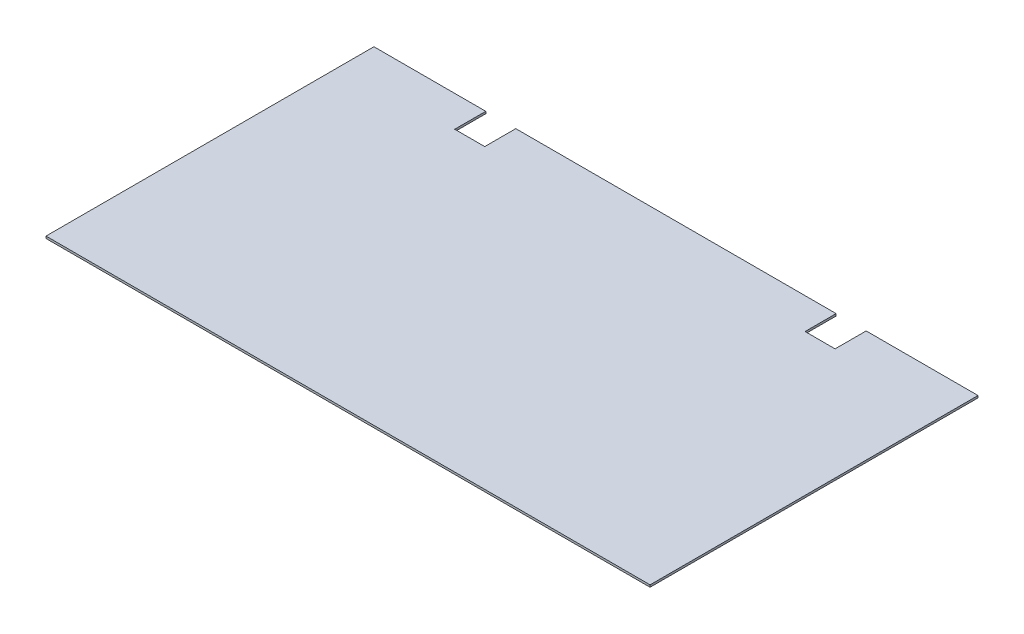
ISO-10303-21;
HEADER;
FILE_DESCRIPTION(('STEP AP214'),'2;1');
FILE_NAME('part.step','',(''),(''),'','','');
FILE_SCHEMA(('AUTOMOTIVE_DESIGN { 1 0 10303 214 1 1 1 1 }'));
ENDSEC;
DATA;
#1=APPLICATION_CONTEXT('core data for automotive mechanical design processes');
#2=APPLICATION_PROTOCOL_DEFINITION('international standard','automotive_design',2000,#1);
#3=PRODUCT_CONTEXT('',#1,'mechanical');
#4=PRODUCT('Part','Part','',(#3));
#5=PRODUCT_RELATED_PRODUCT_CATEGORY('part','',(#4));
#6=PRODUCT_DEFINITION_FORMATION('','',#4);
#7=PRODUCT_DEFINITION_CONTEXT('part definition',#1,'design');
#8=PRODUCT_DEFINITION('design','',#6,#7);
#9=PRODUCT_DEFINITION_SHAPE('','',#8);
#10=(LENGTH_UNIT() NAMED_UNIT(*) SI_UNIT(.MILLI.,.METRE.));
#11=(NAMED_UNIT(*) PLANE_ANGLE_UNIT() SI_UNIT($,.RADIAN.));
#12=(NAMED_UNIT(*) SI_UNIT($,.STERADIAN.) SOLID_ANGLE_UNIT());
#13=UNCERTAINTY_MEASURE_WITH_UNIT(LENGTH_MEASURE(1.E-05),#10,'distance_accuracy_value','');
#14=(GEOMETRIC_REPRESENTATION_CONTEXT(3) GLOBAL_UNCERTAINTY_ASSIGNED_CONTEXT((#13)) GLOBAL_UNIT_ASSIGNED_CONTEXT((#10,
#11,#12)) REPRESENTATION_CONTEXT('',''));
#15=CARTESIAN_POINT('',(0.,0.,0.));
#16=DIRECTION('',(0.,0.,1.));
#17=DIRECTION('',(1.,0.,0.));
#18=AXIS2_PLACEMENT_3D('',#15,#16,#17);
#19=CARTESIAN_POINT('',(222.25,1.5621,-120.65));
#20=DIRECTION('',(0.,0.,1.));
#21=DIRECTION('',(1.,0.,0.));
#22=AXIS2_PLACEMENT_3D('',#19,#20,#21);
#23=PLANE('',#22);
#24=DIRECTION('',(-1.,0.,0.));
#25=VECTOR('',#24,1.);
#26=CARTESIAN_POINT('',(222.25,1.5621,-120.65));
#27=LINE('',#26,#25);
#28=CARTESIAN_POINT('',(-139.954,1.5621,-120.65));
#29=VERTEX_POINT('',#28);
#30=CARTESIAN_POINT('',(-222.25,1.5621,-120.65));
#31=VERTEX_POINT('',#30);
#32=EDGE_CURVE('E191',#29,#31,#27,.T.);
#33=ORIENTED_EDGE('',*,*,#32,.F.);
#34=DIRECTION('',(0.,1.,0.));
#35=VECTOR('',#34,1.);
#36=CARTESIAN_POINT('',(-139.954,-0.000999999999999916,-120.65));
#37=LINE('',#36,#35);
#38=CARTESIAN_POINT('',(-139.954,0.,-120.65));
#39=VERTEX_POINT('',#38);
#40=EDGE_CURVE('E142',#39,#29,#37,.T.);
#41=ORIENTED_EDGE('',*,*,#40,.F.);
#42=DIRECTION('',(-1.,0.,0.));
#43=VECTOR('',#42,1.);
#44=CARTESIAN_POINT('',(222.25,0.,-120.65));
#45=LINE('',#44,#43);
#46=CARTESIAN_POINT('',(-222.25,0.,-120.65));
#47=VERTEX_POINT('',#46);
#48=EDGE_CURVE('E147',#39,#47,#45,.T.);
#49=ORIENTED_EDGE('',*,*,#48,.T.);
#50=DIRECTION('',(0.,-1.,0.));
#51=VECTOR('',#50,1.);
#52=CARTESIAN_POINT('',(-222.25,1.5621,-120.65));
#53=LINE('',#52,#51);
#54=EDGE_CURVE('E195',#31,#47,#53,.T.);
#55=ORIENTED_EDGE('',*,*,#54,.F.);
#56=EDGE_LOOP('',(#33,#41,#49,#55));
#57=FACE_BOUND('',#56,.T.);
#58=ADVANCED_FACE('F35',(#57),#23,.F.);
#59=CARTESIAN_POINT('',(222.25,0.,-120.65));
#60=VERTEX_POINT('',#59);
#61=CARTESIAN_POINT('',(139.954,0.,-120.65));
#62=VERTEX_POINT('',#61);
#63=EDGE_CURVE('E187',#60,#62,#45,.T.);
#64=ORIENTED_EDGE('',*,*,#63,.T.);
#65=DIRECTION('',(0.,1.,0.));
#66=VECTOR('',#65,1.);
#67=CARTESIAN_POINT('',(139.954,-0.000999999999999916,-120.65));
#68=LINE('',#67,#66);
#69=CARTESIAN_POINT('',(139.954,1.5621,-120.65));
#70=VERTEX_POINT('',#69);
#71=EDGE_CURVE('E175',#62,#70,#68,.T.);
#72=ORIENTED_EDGE('',*,*,#71,.T.);
#73=CARTESIAN_POINT('',(222.25,1.5621,-120.65));
#74=VERTEX_POINT('',#73);
#75=EDGE_CURVE('E192',#74,#70,#27,.T.);
#76=ORIENTED_EDGE('',*,*,#75,.F.);
#77=DIRECTION('',(0.,-1.,0.));
#78=VECTOR('',#77,1.);
#79=CARTESIAN_POINT('',(222.25,1.5621,-120.65));
#80=LINE('',#79,#78);
#81=EDGE_CURVE('E208',#74,#60,#80,.T.);
#82=ORIENTED_EDGE('',*,*,#81,.T.);
#83=EDGE_LOOP('',(#64,#72,#76,#82));
#84=FACE_BOUND('',#83,.T.);
#85=ADVANCED_FACE('F221',(#84),#23,.F.);
#86=CARTESIAN_POINT('',(-222.25,1.5621,120.65));
#87=DIRECTION('',(1.,0.,0.));
#88=DIRECTION('',(0.,0.,-1.));
#89=AXIS2_PLACEMENT_3D('',#86,#87,#88);
#90=PLANE('',#89);
#91=DIRECTION('',(0.,0.,1.));
#92=VECTOR('',#91,1.);
#93=CARTESIAN_POINT('',(-222.25,0.,120.65));
#94=LINE('',#93,#92);
#95=CARTESIAN_POINT('',(-222.25,0.,120.65));
#96=VERTEX_POINT('',#95);
#97=EDGE_CURVE('E141',#47,#96,#94,.T.);
#98=ORIENTED_EDGE('',*,*,#97,.T.);
#99=DIRECTION('',(0.,-1.,0.));
#100=VECTOR('',#99,1.);
#101=CARTESIAN_POINT('',(-222.25,1.5621,120.65));
#102=LINE('',#101,#100);
#103=CARTESIAN_POINT('',(-222.25,1.5621,120.65));
#104=VERTEX_POINT('',#103);
#105=EDGE_CURVE('E11',#104,#96,#102,.T.);
#106=ORIENTED_EDGE('',*,*,#105,.F.);
#107=DIRECTION('',(0.,0.,1.));
#108=VECTOR('',#107,1.);
#109=CARTESIAN_POINT('',(-222.25,1.5621,120.65));
#110=LINE('',#109,#108);
#111=EDGE_CURVE('E183',#31,#104,#110,.T.);
#112=ORIENTED_EDGE('',*,*,#111,.F.);
#113=ORIENTED_EDGE('',*,*,#54,.T.);
#114=EDGE_LOOP('',(#98,#106,#112,#113));
#115=FACE_BOUND('',#114,.T.);
#116=ADVANCED_FACE('F37',(#115),#90,.F.);
#117=CARTESIAN_POINT('',(222.25,1.5621,120.65));
#118=DIRECTION('',(0.,0.,-1.));
#119=DIRECTION('',(-1.,0.,0.));
#120=AXIS2_PLACEMENT_3D('',#117,#118,#119);
#121=PLANE('',#120);
#122=DIRECTION('',(1.,0.,0.));
#123=VECTOR('',#122,1.);
#124=CARTESIAN_POINT('',(222.25,0.,120.65));
#125=LINE('',#124,#123);
#126=CARTESIAN_POINT('',(222.25,0.,120.65));
#127=VERTEX_POINT('',#126);
#128=EDGE_CURVE('E199',#96,#127,#125,.T.);
#129=ORIENTED_EDGE('',*,*,#128,.T.);
#130=DIRECTION('',(0.,-1.,0.));
#131=VECTOR('',#130,1.);
#132=CARTESIAN_POINT('',(222.25,1.5621,120.65));
#133=LINE('',#132,#131);
#134=CARTESIAN_POINT('',(222.25,1.5621,120.65));
#135=VERTEX_POINT('',#134);
#136=EDGE_CURVE('E43',#135,#127,#133,.T.);
#137=ORIENTED_EDGE('',*,*,#136,.F.);
#138=DIRECTION('',(1.,0.,0.));
#139=VECTOR('',#138,1.);
#140=CARTESIAN_POINT('',(222.25,1.5621,120.65));
#141=LINE('',#140,#139);
#142=EDGE_CURVE('E186',#104,#135,#141,.T.);
#143=ORIENTED_EDGE('',*,*,#142,.F.);
#144=ORIENTED_EDGE('',*,*,#105,.T.);
#145=EDGE_LOOP('',(#129,#137,#143,#144));
#146=FACE_BOUND('',#145,.T.);
#147=ADVANCED_FACE('F229',(#146),#121,.F.);
#148=CARTESIAN_POINT('',(222.25,1.5621,120.65));
#149=DIRECTION('',(-1.,0.,0.));
#150=DIRECTION('',(0.,0.,1.));
#151=AXIS2_PLACEMENT_3D('',#148,#149,#150);
#152=PLANE('',#151);
#153=DIRECTION('',(0.,0.,-1.));
#154=VECTOR('',#153,1.);
#155=CARTESIAN_POINT('',(222.25,0.,120.65));
#156=LINE('',#155,#154);
#157=EDGE_CURVE('E201',#127,#60,#156,.T.);
#158=ORIENTED_EDGE('',*,*,#157,.T.);
#159=ORIENTED_EDGE('',*,*,#81,.F.);
#160=DIRECTION('',(0.,0.,-1.));
#161=VECTOR('',#160,1.);
#162=CARTESIAN_POINT('',(222.25,1.5621,120.65));
#163=LINE('',#162,#161);
#164=EDGE_CURVE('E189',#135,#74,#163,.T.);
#165=ORIENTED_EDGE('',*,*,#164,.F.);
#166=ORIENTED_EDGE('',*,*,#136,.T.);
#167=EDGE_LOOP('',(#158,#159,#165,#166));
#168=FACE_BOUND('',#167,.T.);
#169=ADVANCED_FACE('F215',(#168),#152,.F.);
#170=CARTESIAN_POINT('',(117.856,0.,-120.65));
#171=VERTEX_POINT('',#170);
#172=CARTESIAN_POINT('',(-117.856,0.,-120.65));
#173=VERTEX_POINT('',#172);
#174=EDGE_CURVE('E205',#171,#173,#45,.T.);
#175=ORIENTED_EDGE('',*,*,#174,.T.);
#176=DIRECTION('',(0.,1.,0.));
#177=VECTOR('',#176,1.);
#178=CARTESIAN_POINT('',(-117.856,-0.000999999999999916,-120.65));
#179=LINE('',#178,#177);
#180=CARTESIAN_POINT('',(-117.856,1.5621,-120.65));
#181=VERTEX_POINT('',#180);
#182=EDGE_CURVE('E157',#173,#181,#179,.T.);
#183=ORIENTED_EDGE('',*,*,#182,.T.);
#184=CARTESIAN_POINT('',(117.856,1.5621,-120.65));
#185=VERTEX_POINT('',#184);
#186=EDGE_CURVE('E196',#185,#181,#27,.T.);
#187=ORIENTED_EDGE('',*,*,#186,.F.);
#188=DIRECTION('',(0.,1.,0.));
#189=VECTOR('',#188,1.);
#190=CARTESIAN_POINT('',(117.856,-0.000999999999999916,-120.65));
#191=LINE('',#190,#189);
#192=EDGE_CURVE('E179',#171,#185,#191,.T.);
#193=ORIENTED_EDGE('',*,*,#192,.F.);
#194=EDGE_LOOP('',(#175,#183,#187,#193));
#195=FACE_BOUND('',#194,.T.);
#196=ADVANCED_FACE('F238',(#195),#23,.F.);
#197=CARTESIAN_POINT('',(0.,1.5621,0.));
#198=DIRECTION('',(0.,1.,0.));
#199=DIRECTION('',(0.,0.,1.));
#200=AXIS2_PLACEMENT_3D('',#197,#198,#199);
#201=PLANE('',#200);
#202=DIRECTION('',(0.,0.,1.));
#203=VECTOR('',#202,1.);
#204=CARTESIAN_POINT('',(-139.954,1.5621,-120.65));
#205=LINE('',#204,#203);
#206=CARTESIAN_POINT('',(-139.954,1.5621,-97.79));
#207=VERTEX_POINT('',#206);
#208=EDGE_CURVE('E130',#29,#207,#205,.T.);
#209=ORIENTED_EDGE('',*,*,#208,.F.);
#210=ORIENTED_EDGE('',*,*,#32,.T.);
#211=ORIENTED_EDGE('',*,*,#111,.T.);
#212=ORIENTED_EDGE('',*,*,#142,.T.);
#213=ORIENTED_EDGE('',*,*,#164,.T.);
#214=ORIENTED_EDGE('',*,*,#75,.T.);
#215=DIRECTION('',(0.,0.,-1.));
#216=VECTOR('',#215,1.);
#217=CARTESIAN_POINT('',(139.954,1.5621,-120.65));
#218=LINE('',#217,#216);
#219=CARTESIAN_POINT('',(139.954,1.5621,-97.79));
#220=VERTEX_POINT('',#219);
#221=EDGE_CURVE('E167',#220,#70,#218,.T.);
#222=ORIENTED_EDGE('',*,*,#221,.F.);
#223=DIRECTION('',(1.,0.,0.));
#224=VECTOR('',#223,1.);
#225=CARTESIAN_POINT('',(139.954,1.5621,-97.79));
#226=LINE('',#225,#224);
#227=CARTESIAN_POINT('',(117.856,1.5621,-97.79));
#228=VERTEX_POINT('',#227);
#229=EDGE_CURVE('E172',#228,#220,#226,.T.);
#230=ORIENTED_EDGE('',*,*,#229,.F.);
#231=DIRECTION('',(0.,0.,1.));
#232=VECTOR('',#231,1.);
#233=CARTESIAN_POINT('',(117.856,1.5621,-120.65));
#234=LINE('',#233,#232);
#235=EDGE_CURVE('E169',#185,#228,#234,.T.);
#236=ORIENTED_EDGE('',*,*,#235,.F.);
#237=ORIENTED_EDGE('',*,*,#186,.T.);
#238=DIRECTION('',(0.,0.,-1.));
#239=VECTOR('',#238,1.);
#240=CARTESIAN_POINT('',(-117.856,1.5621,-120.65));
#241=LINE('',#240,#239);
#242=CARTESIAN_POINT('',(-117.856,1.5621,-97.79));
#243=VERTEX_POINT('',#242);
#244=EDGE_CURVE('E135',#243,#181,#241,.T.);
#245=ORIENTED_EDGE('',*,*,#244,.F.);
#246=DIRECTION('',(1.,0.,0.));
#247=VECTOR('',#246,1.);
#248=CARTESIAN_POINT('',(-139.954,1.5621,-97.79));
#249=LINE('',#248,#247);
#250=EDGE_CURVE('E149',#207,#243,#249,.T.);
#251=ORIENTED_EDGE('',*,*,#250,.F.);
#252=EDGE_LOOP('',(#209,#210,#211,#212,#213,#214,#222,#230,#236,#237,#245,#251));
#253=FACE_BOUND('',#252,.T.);
#254=ADVANCED_FACE('F225',(#253),#201,.T.);
#255=CARTESIAN_POINT('',(0.,0.,0.));
#256=DIRECTION('',(0.,1.,0.));
#257=DIRECTION('',(0.,0.,1.));
#258=AXIS2_PLACEMENT_3D('',#255,#256,#257);
#259=PLANE('',#258);
#260=ORIENTED_EDGE('',*,*,#48,.F.);
#261=DIRECTION('',(0.,0.,-1.));
#262=VECTOR('',#261,1.);
#263=CARTESIAN_POINT('',(-139.954,0.,-120.65));
#264=LINE('',#263,#262);
#265=CARTESIAN_POINT('',(-139.954,0.,-97.79));
#266=VERTEX_POINT('',#265);
#267=EDGE_CURVE('E127',#266,#39,#264,.T.);
#268=ORIENTED_EDGE('',*,*,#267,.F.);
#269=DIRECTION('',(-1.,0.,0.));
#270=VECTOR('',#269,1.);
#271=CARTESIAN_POINT('',(-139.954,0.,-97.79));
#272=LINE('',#271,#270);
#273=CARTESIAN_POINT('',(-117.856,0.,-97.79));
#274=VERTEX_POINT('',#273);
#275=EDGE_CURVE('E138',#274,#266,#272,.T.);
#276=ORIENTED_EDGE('',*,*,#275,.F.);
#277=DIRECTION('',(0.,0.,1.));
#278=VECTOR('',#277,1.);
#279=CARTESIAN_POINT('',(-117.856,0.,-120.65));
#280=LINE('',#279,#278);
#281=EDGE_CURVE('E50',#173,#274,#280,.T.);
#282=ORIENTED_EDGE('',*,*,#281,.F.);
#283=ORIENTED_EDGE('',*,*,#174,.F.);
#284=DIRECTION('',(0.,0.,-1.));
#285=VECTOR('',#284,1.);
#286=CARTESIAN_POINT('',(117.856,0.,-120.65));
#287=LINE('',#286,#285);
#288=CARTESIAN_POINT('',(117.856,0.,-97.79));
#289=VERTEX_POINT('',#288);
#290=EDGE_CURVE('E161',#289,#171,#287,.T.);
#291=ORIENTED_EDGE('',*,*,#290,.F.);
#292=DIRECTION('',(-1.,0.,0.));
#293=VECTOR('',#292,1.);
#294=CARTESIAN_POINT('',(139.954,0.,-97.79));
#295=LINE('',#294,#293);
#296=CARTESIAN_POINT('',(139.954,0.,-97.79));
#297=VERTEX_POINT('',#296);
#298=EDGE_CURVE('E58',#297,#289,#295,.T.);
#299=ORIENTED_EDGE('',*,*,#298,.F.);
#300=DIRECTION('',(0.,0.,1.));
#301=VECTOR('',#300,1.);
#302=CARTESIAN_POINT('',(139.954,0.,-120.65));
#303=LINE('',#302,#301);
#304=EDGE_CURVE('E164',#62,#297,#303,.T.);
#305=ORIENTED_EDGE('',*,*,#304,.F.);
#306=ORIENTED_EDGE('',*,*,#63,.F.);
#307=ORIENTED_EDGE('',*,*,#157,.F.);
#308=ORIENTED_EDGE('',*,*,#128,.F.);
#309=ORIENTED_EDGE('',*,*,#97,.F.);
#310=EDGE_LOOP('',(#260,#268,#276,#282,#283,#291,#299,#305,#306,#307,#308,#309));
#311=FACE_BOUND('',#310,.T.);
#312=ADVANCED_FACE('F145',(#311),#259,.F.);
#313=CARTESIAN_POINT('',(139.954,-0.000999999999999916,-120.65));
#314=DIRECTION('',(1.,0.,0.));
#315=DIRECTION('',(0.,0.,-1.));
#316=AXIS2_PLACEMENT_3D('',#313,#314,#315);
#317=PLANE('',#316);
#318=ORIENTED_EDGE('',*,*,#304,.T.);
#319=DIRECTION('',(0.,1.,0.));
#320=VECTOR('',#319,1.);
#321=CARTESIAN_POINT('',(139.954,-0.000999999999999916,-97.79));
#322=LINE('',#321,#320);
#323=EDGE_CURVE('E151',#297,#220,#322,.T.);
#324=ORIENTED_EDGE('',*,*,#323,.T.);
#325=ORIENTED_EDGE('',*,*,#221,.T.);
#326=ORIENTED_EDGE('',*,*,#71,.F.);
#327=EDGE_LOOP('',(#318,#324,#325,#326));
#328=FACE_BOUND('',#327,.T.);
#329=ADVANCED_FACE('F304',(#328),#317,.F.);
#330=CARTESIAN_POINT('',(139.954,-0.000999999999999916,-97.79));
#331=DIRECTION('',(0.,0.,1.));
#332=DIRECTION('',(1.,0.,0.));
#333=AXIS2_PLACEMENT_3D('',#330,#331,#332);
#334=PLANE('',#333);
#335=ORIENTED_EDGE('',*,*,#298,.T.);
#336=DIRECTION('',(0.,1.,0.));
#337=VECTOR('',#336,1.);
#338=CARTESIAN_POINT('',(117.856,-0.000999999999999916,-97.79));
#339=LINE('',#338,#337);
#340=EDGE_CURVE('E177',#289,#228,#339,.T.);
#341=ORIENTED_EDGE('',*,*,#340,.T.);
#342=ORIENTED_EDGE('',*,*,#229,.T.);
#343=ORIENTED_EDGE('',*,*,#323,.F.);
#344=EDGE_LOOP('',(#335,#341,#342,#343));
#345=FACE_BOUND('',#344,.T.);
#346=ADVANCED_FACE('F245',(#345),#334,.F.);
#347=CARTESIAN_POINT('',(117.856,-0.000999999999999916,-120.65));
#348=DIRECTION('',(-1.,0.,0.));
#349=DIRECTION('',(0.,0.,1.));
#350=AXIS2_PLACEMENT_3D('',#347,#348,#349);
#351=PLANE('',#350);
#352=ORIENTED_EDGE('',*,*,#290,.T.);
#353=ORIENTED_EDGE('',*,*,#192,.T.);
#354=ORIENTED_EDGE('',*,*,#235,.T.);
#355=ORIENTED_EDGE('',*,*,#340,.F.);
#356=EDGE_LOOP('',(#352,#353,#354,#355));
#357=FACE_BOUND('',#356,.T.);
#358=ADVANCED_FACE('F243',(#357),#351,.F.);
#359=CARTESIAN_POINT('',(-139.954,-0.000999999999999916,-120.65));
#360=DIRECTION('',(-1.,0.,0.));
#361=DIRECTION('',(0.,0.,1.));
#362=AXIS2_PLACEMENT_3D('',#359,#360,#361);
#363=PLANE('',#362);
#364=ORIENTED_EDGE('',*,*,#267,.T.);
#365=ORIENTED_EDGE('',*,*,#40,.T.);
#366=ORIENTED_EDGE('',*,*,#208,.T.);
#367=DIRECTION('',(0.,1.,0.));
#368=VECTOR('',#367,1.);
#369=CARTESIAN_POINT('',(-139.954,-0.000999999999999916,-97.79));
#370=LINE('',#369,#368);
#371=EDGE_CURVE('E123',#266,#207,#370,.T.);
#372=ORIENTED_EDGE('',*,*,#371,.F.);
#373=EDGE_LOOP('',(#364,#365,#366,#372));
#374=FACE_BOUND('',#373,.T.);
#375=ADVANCED_FACE('F125',(#374),#363,.F.);
#376=CARTESIAN_POINT('',(-117.856,-0.000999999999999916,-120.65));
#377=DIRECTION('',(1.,0.,0.));
#378=DIRECTION('',(0.,0.,-1.));
#379=AXIS2_PLACEMENT_3D('',#376,#377,#378);
#380=PLANE('',#379);
#381=ORIENTED_EDGE('',*,*,#281,.T.);
#382=DIRECTION('',(0.,1.,0.));
#383=VECTOR('',#382,1.);
#384=CARTESIAN_POINT('',(-117.856,-0.000999999999999916,-97.79));
#385=LINE('',#384,#383);
#386=EDGE_CURVE('E134',#274,#243,#385,.T.);
#387=ORIENTED_EDGE('',*,*,#386,.T.);
#388=ORIENTED_EDGE('',*,*,#244,.T.);
#389=ORIENTED_EDGE('',*,*,#182,.F.);
#390=EDGE_LOOP('',(#381,#387,#388,#389));
#391=FACE_BOUND('',#390,.T.);
#392=ADVANCED_FACE('F247',(#391),#380,.F.);
#393=CARTESIAN_POINT('',(-139.954,-0.000999999999999916,-97.79));
#394=DIRECTION('',(0.,0.,1.));
#395=DIRECTION('',(1.,0.,0.));
#396=AXIS2_PLACEMENT_3D('',#393,#394,#395);
#397=PLANE('',#396);
#398=ORIENTED_EDGE('',*,*,#275,.T.);
#399=ORIENTED_EDGE('',*,*,#371,.T.);
#400=ORIENTED_EDGE('',*,*,#250,.T.);
#401=ORIENTED_EDGE('',*,*,#386,.F.);
#402=EDGE_LOOP('',(#398,#399,#400,#401));
#403=FACE_BOUND('',#402,.T.);
#404=ADVANCED_FACE('F139',(#403),#397,.F.);
#405=CLOSED_SHELL('',(#58,#85,#116,#147,#169,#196,#254,#312,#329,#346,#358,#375,#392,#404));
#406=MANIFOLD_SOLID_BREP('B2',#405);
#407=ADVANCED_BREP_SHAPE_REPRESENTATION('',(#18,#406),#14);
#408=SHAPE_DEFINITION_REPRESENTATION(#9,#407);
ENDSEC;
END-ISO-10303-21;
